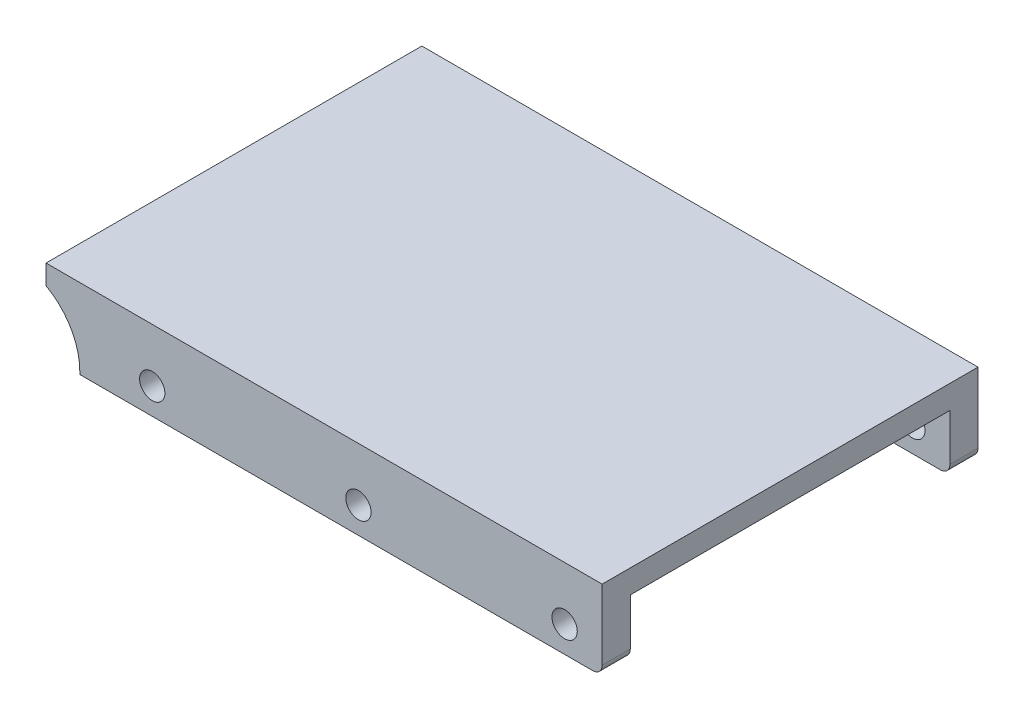
ISO-10303-21;
HEADER;
FILE_DESCRIPTION(('STEP AP214'),'2;1');
FILE_NAME('part.step','',(''),(''),'','','');
FILE_SCHEMA(('AUTOMOTIVE_DESIGN { 1 0 10303 214 1 1 1 1 }'));
ENDSEC;
DATA;
#1=APPLICATION_CONTEXT('core data for automotive mechanical design processes');
#2=APPLICATION_PROTOCOL_DEFINITION('international standard','automotive_design',2000,#1);
#3=PRODUCT_CONTEXT('',#1,'mechanical');
#4=PRODUCT('Part','Part','',(#3));
#5=PRODUCT_RELATED_PRODUCT_CATEGORY('part','',(#4));
#6=PRODUCT_DEFINITION_FORMATION('','',#4);
#7=PRODUCT_DEFINITION_CONTEXT('part definition',#1,'design');
#8=PRODUCT_DEFINITION('design','',#6,#7);
#9=PRODUCT_DEFINITION_SHAPE('','',#8);
#10=(LENGTH_UNIT() NAMED_UNIT(*) SI_UNIT(.MILLI.,.METRE.));
#11=(NAMED_UNIT(*) PLANE_ANGLE_UNIT() SI_UNIT($,.RADIAN.));
#12=(NAMED_UNIT(*) SI_UNIT($,.STERADIAN.) SOLID_ANGLE_UNIT());
#13=UNCERTAINTY_MEASURE_WITH_UNIT(LENGTH_MEASURE(1.E-05),#10,'distance_accuracy_value','');
#14=(GEOMETRIC_REPRESENTATION_CONTEXT(3) GLOBAL_UNCERTAINTY_ASSIGNED_CONTEXT((#13)) GLOBAL_UNIT_ASSIGNED_CONTEXT((#10,
#11,#12)) REPRESENTATION_CONTEXT('',''));
#15=CARTESIAN_POINT('',(0.,0.,0.));
#16=DIRECTION('',(0.,0.,1.));
#17=DIRECTION('',(1.,0.,0.));
#18=AXIS2_PLACEMENT_3D('',#15,#16,#17);
#19=CARTESIAN_POINT('',(76.0000000000001,-2.77555756156289E-13,40.1));
#20=DIRECTION('',(0.,1.,0.));
#21=DIRECTION('',(-1.,0.,0.));
#22=AXIS2_PLACEMENT_3D('',#19,#20,#21);
#23=PLANE('',#22);
#24=DIRECTION('',(1.,0.,0.));
#25=VECTOR('',#24,1.);
#26=CARTESIAN_POINT('',(19.,-3.33066907387547E-13,3.00000000000007));
#27=LINE('',#26,#25);
#28=CARTESIAN_POINT('',(20.2702830408414,0.,3.00000000000001));
#29=VERTEX_POINT('',#28);
#30=CARTESIAN_POINT('',(75.0000000000008,-1.80411241501588E-13,2.99999999999998));
#31=VERTEX_POINT('',#30);
#32=EDGE_CURVE('E239',#29,#31,#27,.T.);
#33=ORIENTED_EDGE('',*,*,#32,.F.);
#34=DIRECTION('',(0.,0.,1.00000000000001));
#35=VECTOR('',#34,1.);
#36=CARTESIAN_POINT('',(20.2702830408414,-4.9960036108132E-13,0.));
#37=LINE('',#36,#35);
#38=CARTESIAN_POINT('',(20.2702830408414,-4.9960036108132E-13,0.));
#39=VERTEX_POINT('',#38);
#40=EDGE_CURVE('E240',#39,#29,#37,.T.);
#41=ORIENTED_EDGE('',*,*,#40,.F.);
#42=DIRECTION('',(1.,0.,0.));
#43=VECTOR('',#42,1.);
#44=CARTESIAN_POINT('',(76.0000000000003,0.,0.));
#45=LINE('',#44,#43);
#46=CARTESIAN_POINT('',(75.0000000000005,0.,0.));
#47=VERTEX_POINT('',#46);
#48=EDGE_CURVE('E201',#39,#47,#45,.T.);
#49=ORIENTED_EDGE('',*,*,#48,.T.);
#50=DIRECTION('',(0.,0.,-1.00000000000001));
#51=VECTOR('',#50,1.);
#52=CARTESIAN_POINT('',(75.0000000000005,-5.68989300120393E-13,40.1000000000002));
#53=LINE('',#52,#51);
#54=EDGE_CURVE('E168',#47,#31,#53,.F.);
#55=ORIENTED_EDGE('',*,*,#54,.T.);
#56=EDGE_LOOP('',(#33,#41,#49,#55));
#57=FACE_BOUND('',#56,.T.);
#58=ADVANCED_FACE('F34',(#57),#23,.F.);
#59=CARTESIAN_POINT('',(20.2702830408415,7.27395464180314,0.));
#60=DIRECTION('',(1.,0.,0.));
#61=DIRECTION('',(0.,0.,-1.00000000000001));
#62=AXIS2_PLACEMENT_3D('',#59,#60,#61);
#63=PLANE('',#62);
#64=ORIENTED_EDGE('',*,*,#40,.T.);
#65=DIRECTION('',(0.,1.,0.));
#66=VECTOR('',#65,1.);
#67=CARTESIAN_POINT('',(20.2702830408414,7.27395464180332,3.00000000000004));
#68=LINE('',#67,#66);
#69=CARTESIAN_POINT('',(20.2702830408414,0.273954641803464,2.99999999999995));
#70=VERTEX_POINT('',#69);
#71=EDGE_CURVE('E257',#29,#70,#68,.T.);
#72=ORIENTED_EDGE('',*,*,#71,.T.);
#73=DIRECTION('',(0.,0.,1.00000000000001));
#74=VECTOR('',#73,1.);
#75=CARTESIAN_POINT('',(20.2702830408414,0.273954641803187,0.));
#76=LINE('',#75,#74);
#77=CARTESIAN_POINT('',(20.2702830408414,0.273954641803187,0.));
#78=VERTEX_POINT('',#77);
#79=EDGE_CURVE('E157',#70,#78,#76,.F.);
#80=ORIENTED_EDGE('',*,*,#79,.T.);
#81=DIRECTION('',(0.,1.,0.));
#82=VECTOR('',#81,1.);
#83=CARTESIAN_POINT('',(20.2702830408415,7.27395464180314,0.));
#84=LINE('',#83,#82);
#85=EDGE_CURVE('E249',#39,#78,#84,.T.);
#86=ORIENTED_EDGE('',*,*,#85,.F.);
#87=EDGE_LOOP('',(#64,#72,#80,#86));
#88=FACE_BOUND('',#87,.T.);
#89=ADVANCED_FACE('F285',(#88),#63,.F.);
#90=CARTESIAN_POINT('',(5.99999999999971,8.49999999999998,40.1));
#91=DIRECTION('',(0.,-1.,0.));
#92=DIRECTION('',(0.,0.,-1.00000000000001));
#93=AXIS2_PLACEMENT_3D('',#90,#91,#92);
#94=PLANE('',#93);
#95=DIRECTION('',(-1.,0.,0.));
#96=VECTOR('',#95,1.);
#97=CARTESIAN_POINT('',(5.99999999999984,8.49999999999942,0.));
#98=LINE('',#97,#96);
#99=CARTESIAN_POINT('',(76.,8.50000000000001,0.));
#100=VERTEX_POINT('',#99);
#101=CARTESIAN_POINT('',(16.6623999999998,8.49999999999944,0.));
#102=VERTEX_POINT('',#101);
#103=EDGE_CURVE('E205',#100,#102,#98,.T.);
#104=ORIENTED_EDGE('',*,*,#103,.T.);
#105=DIRECTION('',(0.,0.,1.00000000000001));
#106=VECTOR('',#105,1.);
#107=CARTESIAN_POINT('',(16.6623999999998,8.49999999999944,0.));
#108=LINE('',#107,#106);
#109=CARTESIAN_POINT('',(16.6623999999999,8.49999999999944,40.1));
#110=VERTEX_POINT('',#109);
#111=EDGE_CURVE('E250',#102,#110,#108,.T.);
#112=ORIENTED_EDGE('',*,*,#111,.T.);
#113=DIRECTION('',(-1.,0.,0.));
#114=VECTOR('',#113,1.);
#115=CARTESIAN_POINT('',(5.99999999999971,8.49999999999998,40.1));
#116=LINE('',#115,#114);
#117=CARTESIAN_POINT('',(76.,8.49999999999972,40.1));
#118=VERTEX_POINT('',#117);
#119=EDGE_CURVE('E204',#118,#110,#116,.T.);
#120=ORIENTED_EDGE('',*,*,#119,.F.);
#121=DIRECTION('',(0.,0.,-1.00000000000001));
#122=VECTOR('',#121,1.);
#123=CARTESIAN_POINT('',(76.,8.49999999999972,40.1));
#124=LINE('',#123,#122);
#125=EDGE_CURVE('E180',#118,#100,#124,.T.);
#126=ORIENTED_EDGE('',*,*,#125,.T.);
#127=EDGE_LOOP('',(#104,#112,#120,#126));
#128=FACE_BOUND('',#127,.T.);
#129=ADVANCED_FACE('F313',(#128),#94,.F.);
#130=CARTESIAN_POINT('',(27.996,2.8,-10.7000000000001));
#131=DIRECTION('',(0.,0.,1.00000000000001));
#132=DIRECTION('',(1.,0.,0.));
#133=AXIS2_PLACEMENT_3D('',#130,#131,#132);
#134=CYLINDRICAL_SURFACE('',#133,1.35);
#135=CARTESIAN_POINT('',(27.996,2.79999999999997,37.1));
#136=DIRECTION('',(0.,0.,1.00000000000001));
#137=DIRECTION('',(1.,0.,0.));
#138=AXIS2_PLACEMENT_3D('',#135,#136,#137);
#139=CIRCLE('',#138,1.35);
#140=CARTESIAN_POINT('',(29.346,2.79999999999997,37.1));
#141=VERTEX_POINT('',#140);
#142=EDGE_CURVE('E225',#141,#141,#139,.F.);
#143=ORIENTED_EDGE('',*,*,#142,.T.);
#144=EDGE_LOOP('',(#143));
#145=FACE_BOUND('',#144,.T.);
#146=CARTESIAN_POINT('',(27.996,2.79999999999983,40.1));
#147=DIRECTION('',(0.,0.,1.00000000000001));
#148=DIRECTION('',(1.,0.,0.));
#149=AXIS2_PLACEMENT_3D('',#146,#147,#148);
#150=CIRCLE('',#149,1.35);
#151=CARTESIAN_POINT('',(29.3460000000001,2.79999999999983,40.1));
#152=VERTEX_POINT('',#151);
#153=EDGE_CURVE('E197',#152,#152,#150,.T.);
#154=ORIENTED_EDGE('',*,*,#153,.T.);
#155=EDGE_LOOP('',(#154));
#156=FACE_BOUND('',#155,.T.);
#157=ADVANCED_FACE('F328',(#145,#156),#134,.F.);
#158=CARTESIAN_POINT('',(49.9960000000001,2.79999999999971,-10.7000000000001));
#159=DIRECTION('',(0.,0.,1.00000000000001));
#160=DIRECTION('',(1.,0.,0.));
#161=AXIS2_PLACEMENT_3D('',#158,#159,#160);
#162=CYLINDRICAL_SURFACE('',#161,1.35);
#163=CARTESIAN_POINT('',(49.996,2.79999999999997,37.1000000000001));
#164=DIRECTION('',(0.,0.,1.00000000000001));
#165=DIRECTION('',(1.,0.,0.));
#166=AXIS2_PLACEMENT_3D('',#163,#164,#165);
#167=CIRCLE('',#166,1.35);
#168=CARTESIAN_POINT('',(51.346,2.79999999999997,37.1000000000001));
#169=VERTEX_POINT('',#168);
#170=EDGE_CURVE('E184',#169,#169,#167,.F.);
#171=ORIENTED_EDGE('',*,*,#170,.T.);
#172=EDGE_LOOP('',(#171));
#173=FACE_BOUND('',#172,.T.);
#174=CARTESIAN_POINT('',(49.9960000000002,2.8,40.1));
#175=DIRECTION('',(0.,0.,1.00000000000001));
#176=DIRECTION('',(1.,0.,0.));
#177=AXIS2_PLACEMENT_3D('',#174,#175,#176);
#178=CIRCLE('',#177,1.35);
#179=CARTESIAN_POINT('',(51.3460000000002,2.8,40.1));
#180=VERTEX_POINT('',#179);
#181=EDGE_CURVE('E192',#180,#180,#178,.T.);
#182=ORIENTED_EDGE('',*,*,#181,.T.);
#183=EDGE_LOOP('',(#182));
#184=FACE_BOUND('',#183,.T.);
#185=ADVANCED_FACE('F321',(#173,#184),#162,.F.);
#186=CARTESIAN_POINT('',(71.9960000000003,2.79999999999932,-10.7));
#187=DIRECTION('',(0.,0.,1.00000000000001));
#188=DIRECTION('',(1.,0.,0.));
#189=AXIS2_PLACEMENT_3D('',#186,#187,#188);
#190=CYLINDRICAL_SURFACE('',#189,1.35000000000001);
#191=CARTESIAN_POINT('',(71.9960000000004,2.80000000000018,37.1000000000002));
#192=DIRECTION('',(0.,0.,1.00000000000001));
#193=DIRECTION('',(1.,0.,0.));
#194=AXIS2_PLACEMENT_3D('',#191,#192,#193);
#195=CIRCLE('',#194,1.35000000000001);
#196=CARTESIAN_POINT('',(73.3460000000005,2.80000000000018,37.1000000000002));
#197=VERTEX_POINT('',#196);
#198=EDGE_CURVE('E181',#197,#197,#195,.F.);
#199=ORIENTED_EDGE('',*,*,#198,.T.);
#200=EDGE_LOOP('',(#199));
#201=FACE_BOUND('',#200,.T.);
#202=CARTESIAN_POINT('',(71.9960000000003,2.79999999999997,40.0999999999999));
#203=DIRECTION('',(0.,0.,1.00000000000001));
#204=DIRECTION('',(1.,0.,0.));
#205=AXIS2_PLACEMENT_3D('',#202,#203,#204);
#206=CIRCLE('',#205,1.35000000000001);
#207=CARTESIAN_POINT('',(73.3460000000003,2.79999999999997,40.0999999999999));
#208=VERTEX_POINT('',#207);
#209=EDGE_CURVE('E193',#208,#208,#206,.T.);
#210=ORIENTED_EDGE('',*,*,#209,.T.);
#211=EDGE_LOOP('',(#210));
#212=FACE_BOUND('',#211,.T.);
#213=ADVANCED_FACE('F316',(#201,#212),#190,.F.);
#214=CARTESIAN_POINT('',(20.2702830408413,0.,37.1000000000001));
#215=VERTEX_POINT('',#214);
#216=CARTESIAN_POINT('',(20.2702830408415,-3.88578058618805E-13,40.1000000000001));
#217=VERTEX_POINT('',#216);
#218=EDGE_CURVE('E245',#215,#217,#37,.T.);
#219=ORIENTED_EDGE('',*,*,#218,.F.);
#220=DIRECTION('',(-1.,0.,0.));
#221=VECTOR('',#220,1.);
#222=CARTESIAN_POINT('',(19.,-4.30211422042248E-13,37.1000000000004));
#223=LINE('',#222,#221);
#224=CARTESIAN_POINT('',(75.0000000000006,0.,37.1));
#225=VERTEX_POINT('',#224);
#226=EDGE_CURVE('E237',#225,#215,#223,.T.);
#227=ORIENTED_EDGE('',*,*,#226,.F.);
#228=DIRECTION('',(0.,0.,-1.00000000000001));
#229=VECTOR('',#228,1.);
#230=CARTESIAN_POINT('',(75.0000000000005,-5.68989300120393E-13,40.1000000000002));
#231=LINE('',#230,#229);
#232=CARTESIAN_POINT('',(75.0000000000005,-5.68989300120393E-13,40.1000000000002));
#233=VERTEX_POINT('',#232);
#234=EDGE_CURVE('E171',#225,#233,#231,.F.);
#235=ORIENTED_EDGE('',*,*,#234,.T.);
#236=DIRECTION('',(1.,0.,0.));
#237=VECTOR('',#236,1.);
#238=CARTESIAN_POINT('',(76.0000000000001,-2.77555756156289E-13,40.1));
#239=LINE('',#238,#237);
#240=EDGE_CURVE('E208',#217,#233,#239,.T.);
#241=ORIENTED_EDGE('',*,*,#240,.F.);
#242=EDGE_LOOP('',(#219,#227,#235,#241));
#243=FACE_BOUND('',#242,.T.);
#244=ADVANCED_FACE('F268',(#243),#23,.F.);
#245=CARTESIAN_POINT('',(76.,8.49999999999972,40.1));
#246=DIRECTION('',(-1.,0.,0.));
#247=DIRECTION('',(0.,0.,1.00000000000001));
#248=AXIS2_PLACEMENT_3D('',#245,#246,#247);
#249=PLANE('',#248);
#250=DIRECTION('',(0.,-1.,0.));
#251=VECTOR('',#250,1.);
#252=CARTESIAN_POINT('',(76.0000000000003,8.49999999999999,3.00000000000002));
#253=LINE('',#252,#251);
#254=CARTESIAN_POINT('',(76.0000000000003,5.99999999999999,3.00000000000002));
#255=VERTEX_POINT('',#254);
#256=CARTESIAN_POINT('',(76.0000000000003,0.99999999999982,3.00000000000003));
#257=VERTEX_POINT('',#256);
#258=EDGE_CURVE('E185',#255,#257,#253,.T.);
#259=ORIENTED_EDGE('',*,*,#258,.T.);
#260=DIRECTION('',(0.,0.,-1.00000000000001));
#261=VECTOR('',#260,1.);
#262=CARTESIAN_POINT('',(76.0000000000002,0.999999999999779,40.1000000000002));
#263=LINE('',#262,#261);
#264=CARTESIAN_POINT('',(76.0000000000003,1.00000000000028,0.));
#265=VERTEX_POINT('',#264);
#266=EDGE_CURVE('E162',#257,#265,#263,.T.);
#267=ORIENTED_EDGE('',*,*,#266,.T.);
#268=DIRECTION('',(0.,1.,0.));
#269=VECTOR('',#268,1.);
#270=CARTESIAN_POINT('',(76.,8.50000000000001,0.));
#271=LINE('',#270,#269);
#272=EDGE_CURVE('E209',#265,#100,#271,.T.);
#273=ORIENTED_EDGE('',*,*,#272,.T.);
#274=ORIENTED_EDGE('',*,*,#125,.F.);
#275=DIRECTION('',(0.,1.,0.));
#276=VECTOR('',#275,1.);
#277=CARTESIAN_POINT('',(76.,8.49999999999972,40.1));
#278=LINE('',#277,#276);
#279=CARTESIAN_POINT('',(76.0000000000002,0.999999999999779,40.1000000000002));
#280=VERTEX_POINT('',#279);
#281=EDGE_CURVE('E214',#280,#118,#278,.T.);
#282=ORIENTED_EDGE('',*,*,#281,.F.);
#283=DIRECTION('',(0.,0.,-1.00000000000001));
#284=VECTOR('',#283,1.);
#285=CARTESIAN_POINT('',(76.0000000000002,0.999999999999779,40.1000000000002));
#286=LINE('',#285,#284);
#287=CARTESIAN_POINT('',(76.0000000000003,0.999999999999918,37.1));
#288=VERTEX_POINT('',#287);
#289=EDGE_CURVE('E165',#280,#288,#286,.T.);
#290=ORIENTED_EDGE('',*,*,#289,.T.);
#291=DIRECTION('',(0.,1.,0.));
#292=VECTOR('',#291,1.);
#293=CARTESIAN_POINT('',(76.0000000000003,8.49999999999999,37.1000000000001));
#294=LINE('',#293,#292);
#295=CARTESIAN_POINT('',(76.0000000000003,5.99999999999989,37.1000000000001));
#296=VERTEX_POINT('',#295);
#297=EDGE_CURVE('E223',#288,#296,#294,.T.);
#298=ORIENTED_EDGE('',*,*,#297,.T.);
#299=DIRECTION('',(0.,0.,1.00000000000001));
#300=VECTOR('',#299,1.);
#301=CARTESIAN_POINT('',(76.,5.99999999999995,40.1));
#302=LINE('',#301,#300);
#303=EDGE_CURVE('E135',#255,#296,#302,.T.);
#304=ORIENTED_EDGE('',*,*,#303,.F.);
#305=EDGE_LOOP('',(#259,#267,#273,#274,#282,#290,#298,#304));
#306=FACE_BOUND('',#305,.T.);
#307=ADVANCED_FACE('F295',(#306),#249,.F.);
#308=CARTESIAN_POINT('',(-3.05311331771918E-13,0.,40.0999999999999));
#309=DIRECTION('',(0.,0.,-1.00000000000001));
#310=DIRECTION('',(-1.,0.,0.));
#311=AXIS2_PLACEMENT_3D('',#308,#309,#310);
#312=PLANE('',#311);
#313=ORIENTED_EDGE('',*,*,#119,.T.);
#314=DIRECTION('',(0.,1.,0.));
#315=VECTOR('',#314,1.);
#316=CARTESIAN_POINT('',(16.6623999999999,8.49999999999944,40.1));
#317=LINE('',#316,#315);
#318=CARTESIAN_POINT('',(16.6623999999999,6.39715172628352,40.1));
#319=VERTEX_POINT('',#318);
#320=EDGE_CURVE('E255',#319,#110,#317,.T.);
#321=ORIENTED_EDGE('',*,*,#320,.F.);
#322=CARTESIAN_POINT('',(13.2702830408414,0.273954641803451,40.1));
#323=DIRECTION('',(0.,0.,-1.00000000000001));
#324=DIRECTION('',(-1.,0.,0.));
#325=AXIS2_PLACEMENT_3D('',#322,#323,#324);
#326=CIRCLE('',#325,7.);
#327=CARTESIAN_POINT('',(20.2702830408416,0.273954641802979,40.1000000000001));
#328=VERTEX_POINT('',#327);
#329=EDGE_CURVE('E153',#319,#328,#326,.T.);
#330=ORIENTED_EDGE('',*,*,#329,.T.);
#331=DIRECTION('',(0.,1.,0.));
#332=VECTOR('',#331,1.);
#333=CARTESIAN_POINT('',(20.2702830408413,7.27395464180318,40.1));
#334=LINE('',#333,#332);
#335=EDGE_CURVE('E246',#217,#328,#334,.T.);
#336=ORIENTED_EDGE('',*,*,#335,.F.);
#337=ORIENTED_EDGE('',*,*,#240,.T.);
#338=CARTESIAN_POINT('',(75.0000000000003,0.999999999999973,40.1000000000002));
#339=DIRECTION('',(0.,0.,-1.00000000000001));
#340=DIRECTION('',(-1.,0.,0.));
#341=AXIS2_PLACEMENT_3D('',#338,#339,#340);
#342=CIRCLE('',#341,1.);
#343=EDGE_CURVE('E177',#233,#280,#342,.F.);
#344=ORIENTED_EDGE('',*,*,#343,.T.);
#345=ORIENTED_EDGE('',*,*,#281,.T.);
#346=EDGE_LOOP('',(#313,#321,#330,#336,#337,#344,#345));
#347=FACE_BOUND('',#346,.T.);
#348=ORIENTED_EDGE('',*,*,#209,.F.);
#349=EDGE_LOOP('',(#348));
#350=FACE_BOUND('',#349,.T.);
#351=ORIENTED_EDGE('',*,*,#181,.F.);
#352=EDGE_LOOP('',(#351));
#353=FACE_BOUND('',#352,.T.);
#354=ORIENTED_EDGE('',*,*,#153,.F.);
#355=EDGE_LOOP('',(#354));
#356=FACE_BOUND('',#355,.T.);
#357=ADVANCED_FACE('F272',(#347,#350,#353,#356),#312,.F.);
#358=CARTESIAN_POINT('',(0.,0.,0.));
#359=DIRECTION('',(0.,0.,-1.00000000000001));
#360=DIRECTION('',(-1.,0.,0.));
#361=AXIS2_PLACEMENT_3D('',#358,#359,#360);
#362=PLANE('',#361);
#363=DIRECTION('',(0.,1.,0.));
#364=VECTOR('',#363,1.);
#365=CARTESIAN_POINT('',(16.6623999999998,8.49999999999944,0.));
#366=LINE('',#365,#364);
#367=CARTESIAN_POINT('',(16.6624,6.39715172628345,0.));
#368=VERTEX_POINT('',#367);
#369=EDGE_CURVE('E57',#368,#102,#366,.T.);
#370=ORIENTED_EDGE('',*,*,#369,.T.);
#371=ORIENTED_EDGE('',*,*,#103,.F.);
#372=ORIENTED_EDGE('',*,*,#272,.F.);
#373=CARTESIAN_POINT('',(75.0000000000003,0.999999999999709,0.));
#374=DIRECTION('',(0.,0.,-1.00000000000001));
#375=DIRECTION('',(-1.,0.,0.));
#376=AXIS2_PLACEMENT_3D('',#373,#374,#375);
#377=CIRCLE('',#376,1.);
#378=EDGE_CURVE('E174',#265,#47,#377,.T.);
#379=ORIENTED_EDGE('',*,*,#378,.T.);
#380=ORIENTED_EDGE('',*,*,#48,.F.);
#381=ORIENTED_EDGE('',*,*,#85,.T.);
#382=CARTESIAN_POINT('',(13.2702830408414,0.273954641803159,0.));
#383=DIRECTION('',(0.,0.,-1.00000000000001));
#384=DIRECTION('',(-1.,0.,0.));
#385=AXIS2_PLACEMENT_3D('',#382,#383,#384);
#386=CIRCLE('',#385,7.);
#387=EDGE_CURVE('E150',#78,#368,#386,.F.);
#388=ORIENTED_EDGE('',*,*,#387,.T.);
#389=EDGE_LOOP('',(#370,#371,#372,#379,#380,#381,#388));
#390=FACE_BOUND('',#389,.T.);
#391=CARTESIAN_POINT('',(71.9960000000003,2.79999999999971,0.));
#392=DIRECTION('',(0.,0.,-1.00000000000001));
#393=DIRECTION('',(-1.,0.,0.));
#394=AXIS2_PLACEMENT_3D('',#391,#392,#393);
#395=CIRCLE('',#394,1.35000000000001);
#396=CARTESIAN_POINT('',(70.6460000000003,2.7999999999997,0.));
#397=VERTEX_POINT('',#396);
#398=EDGE_CURVE('E189',#397,#397,#395,.T.);
#399=ORIENTED_EDGE('',*,*,#398,.F.);
#400=EDGE_LOOP('',(#399));
#401=FACE_BOUND('',#400,.T.);
#402=CARTESIAN_POINT('',(49.9960000000001,2.7999999999998,0.));
#403=DIRECTION('',(0.,0.,-1.00000000000001));
#404=DIRECTION('',(-1.,0.,0.));
#405=AXIS2_PLACEMENT_3D('',#402,#403,#404);
#406=CIRCLE('',#405,1.35);
#407=CARTESIAN_POINT('',(48.6460000000001,2.7999999999998,0.));
#408=VERTEX_POINT('',#407);
#409=EDGE_CURVE('E194',#408,#408,#406,.T.);
#410=ORIENTED_EDGE('',*,*,#409,.F.);
#411=EDGE_LOOP('',(#410));
#412=FACE_BOUND('',#411,.T.);
#413=CARTESIAN_POINT('',(27.9959999999999,2.79999999999996,0.));
#414=DIRECTION('',(0.,0.,-1.00000000000001));
#415=DIRECTION('',(-1.,0.,0.));
#416=AXIS2_PLACEMENT_3D('',#413,#414,#415);
#417=CIRCLE('',#416,1.35);
#418=CARTESIAN_POINT('',(26.6459999999999,2.79999999999995,0.));
#419=VERTEX_POINT('',#418);
#420=EDGE_CURVE('E198',#419,#419,#417,.T.);
#421=ORIENTED_EDGE('',*,*,#420,.F.);
#422=EDGE_LOOP('',(#421));
#423=FACE_BOUND('',#422,.T.);
#424=ADVANCED_FACE('F279',(#390,#401,#412,#423),#362,.T.);
#425=CARTESIAN_POINT('',(27.996,2.80000000000008,3.00000000000004));
#426=DIRECTION('',(0.,0.,-1.00000000000001));
#427=DIRECTION('',(-1.,0.,0.));
#428=AXIS2_PLACEMENT_3D('',#425,#426,#427);
#429=CIRCLE('',#428,1.35);
#430=CARTESIAN_POINT('',(26.646,2.80000000000008,3.00000000000004));
#431=VERTEX_POINT('',#430);
#432=EDGE_CURVE('E232',#431,#431,#429,.F.);
#433=ORIENTED_EDGE('',*,*,#432,.T.);
#434=EDGE_LOOP('',(#433));
#435=FACE_BOUND('',#434,.T.);
#436=ORIENTED_EDGE('',*,*,#420,.T.);
#437=EDGE_LOOP('',(#436));
#438=FACE_BOUND('',#437,.T.);
#439=ADVANCED_FACE('F341',(#435,#438),#134,.F.);
#440=CARTESIAN_POINT('',(49.9959999999999,2.79999999999978,2.99999999999987));
#441=DIRECTION('',(0.,0.,-1.00000000000001));
#442=DIRECTION('',(-1.,0.,0.));
#443=AXIS2_PLACEMENT_3D('',#440,#441,#442);
#444=CIRCLE('',#443,1.35);
#445=CARTESIAN_POINT('',(48.6459999999999,2.79999999999977,2.99999999999987));
#446=VERTEX_POINT('',#445);
#447=EDGE_CURVE('E188',#446,#446,#444,.F.);
#448=ORIENTED_EDGE('',*,*,#447,.T.);
#449=EDGE_LOOP('',(#448));
#450=FACE_BOUND('',#449,.T.);
#451=ORIENTED_EDGE('',*,*,#409,.T.);
#452=EDGE_LOOP('',(#451));
#453=FACE_BOUND('',#452,.T.);
#454=ADVANCED_FACE('F331',(#450,#453),#162,.F.);
#455=CARTESIAN_POINT('',(71.9960000000002,2.79999999999955,2.99999999999981));
#456=DIRECTION('',(0.,0.,-1.00000000000001));
#457=DIRECTION('',(-1.,0.,0.));
#458=AXIS2_PLACEMENT_3D('',#455,#456,#457);
#459=CIRCLE('',#458,1.35000000000001);
#460=CARTESIAN_POINT('',(70.6460000000002,2.79999999999955,2.99999999999981));
#461=VERTEX_POINT('',#460);
#462=EDGE_CURVE('E137',#461,#461,#459,.F.);
#463=ORIENTED_EDGE('',*,*,#462,.T.);
#464=EDGE_LOOP('',(#463));
#465=FACE_BOUND('',#464,.T.);
#466=ORIENTED_EDGE('',*,*,#398,.T.);
#467=EDGE_LOOP('',(#466));
#468=FACE_BOUND('',#467,.T.);
#469=ADVANCED_FACE('F324',(#465,#468),#190,.F.);
#470=CARTESIAN_POINT('',(-5.13478148889135E-13,5.99999999999971,0.));
#471=DIRECTION('',(0.,-1.,0.));
#472=DIRECTION('',(1.,0.,0.));
#473=AXIS2_PLACEMENT_3D('',#470,#471,#472);
#474=PLANE('',#473);
#475=DIRECTION('',(-1.,0.,0.));
#476=VECTOR('',#475,1.);
#477=CARTESIAN_POINT('',(19.,5.99999999999971,37.1000000000001));
#478=LINE('',#477,#476);
#479=CARTESIAN_POINT('',(17.2967460738117,5.99999999999946,37.1000000000003));
#480=VERTEX_POINT('',#479);
#481=EDGE_CURVE('E131',#296,#480,#478,.T.);
#482=ORIENTED_EDGE('',*,*,#481,.T.);
#483=DIRECTION('',(0.,0.,-1.00000000000001));
#484=VECTOR('',#483,1.);
#485=CARTESIAN_POINT('',(17.2967460738117,5.99999999999938,0.));
#486=LINE('',#485,#484);
#487=CARTESIAN_POINT('',(17.2967460738117,5.99999999999939,3.00000000000005));
#488=VERTEX_POINT('',#487);
#489=EDGE_CURVE('E42',#488,#480,#486,.F.);
#490=ORIENTED_EDGE('',*,*,#489,.F.);
#491=DIRECTION('',(1.,0.,0.));
#492=VECTOR('',#491,1.);
#493=CARTESIAN_POINT('',(19.,5.99999999999941,3.00000000000001));
#494=LINE('',#493,#492);
#495=EDGE_CURVE('E138',#488,#255,#494,.T.);
#496=ORIENTED_EDGE('',*,*,#495,.T.);
#497=ORIENTED_EDGE('',*,*,#303,.T.);
#498=EDGE_LOOP('',(#482,#490,#496,#497));
#499=FACE_BOUND('',#498,.T.);
#500=ADVANCED_FACE('F132',(#499),#474,.T.);
#501=CARTESIAN_POINT('',(19.,5.99999999999971,37.1000000000001));
#502=DIRECTION('',(0.,0.,1.00000000000001));
#503=DIRECTION('',(1.,0.,0.));
#504=AXIS2_PLACEMENT_3D('',#501,#502,#503);
#505=PLANE('',#504);
#506=ORIENTED_EDGE('',*,*,#142,.F.);
#507=EDGE_LOOP('',(#506));
#508=FACE_BOUND('',#507,.T.);
#509=ORIENTED_EDGE('',*,*,#198,.F.);
#510=EDGE_LOOP('',(#509));
#511=FACE_BOUND('',#510,.T.);
#512=ORIENTED_EDGE('',*,*,#170,.F.);
#513=EDGE_LOOP('',(#512));
#514=FACE_BOUND('',#513,.T.);
#515=ORIENTED_EDGE('',*,*,#226,.T.);
#516=DIRECTION('',(0.,-1.,0.));
#517=VECTOR('',#516,1.);
#518=CARTESIAN_POINT('',(20.2702830408412,7.27395464180344,37.1));
#519=LINE('',#518,#517);
#520=CARTESIAN_POINT('',(20.2702830408412,0.273954641803173,37.1000000000002));
#521=VERTEX_POINT('',#520);
#522=EDGE_CURVE('E49',#521,#215,#519,.T.);
#523=ORIENTED_EDGE('',*,*,#522,.F.);
#524=CARTESIAN_POINT('',(13.2702830408414,0.27395464180309,37.1000000000003));
#525=DIRECTION('',(0.,0.,1.00000000000001));
#526=DIRECTION('',(1.,0.,0.));
#527=AXIS2_PLACEMENT_3D('',#524,#525,#526);
#528=CIRCLE('',#527,7.);
#529=EDGE_CURVE('E140',#480,#521,#528,.F.);
#530=ORIENTED_EDGE('',*,*,#529,.F.);
#531=ORIENTED_EDGE('',*,*,#481,.F.);
#532=ORIENTED_EDGE('',*,*,#297,.F.);
#533=CARTESIAN_POINT('',(75.0000000000006,0.99999999999989,37.1000000000002));
#534=DIRECTION('',(0.,0.,1.00000000000001));
#535=DIRECTION('',(1.,0.,0.));
#536=AXIS2_PLACEMENT_3D('',#533,#534,#535);
#537=CIRCLE('',#536,1.);
#538=EDGE_CURVE('E158',#288,#225,#537,.F.);
#539=ORIENTED_EDGE('',*,*,#538,.T.);
#540=EDGE_LOOP('',(#515,#523,#530,#531,#532,#539));
#541=FACE_BOUND('',#540,.T.);
#542=ADVANCED_FACE('F141',(#508,#511,#514,#541),#505,.F.);
#543=CARTESIAN_POINT('',(19.,5.99999999999941,3.00000000000001));
#544=DIRECTION('',(0.,0.,-1.00000000000001));
#545=DIRECTION('',(-1.,0.,0.));
#546=AXIS2_PLACEMENT_3D('',#543,#544,#545);
#547=PLANE('',#546);
#548=ORIENTED_EDGE('',*,*,#432,.F.);
#549=EDGE_LOOP('',(#548));
#550=FACE_BOUND('',#549,.T.);
#551=ORIENTED_EDGE('',*,*,#462,.F.);
#552=EDGE_LOOP('',(#551));
#553=FACE_BOUND('',#552,.T.);
#554=ORIENTED_EDGE('',*,*,#447,.F.);
#555=EDGE_LOOP('',(#554));
#556=FACE_BOUND('',#555,.T.);
#557=ORIENTED_EDGE('',*,*,#495,.F.);
#558=CARTESIAN_POINT('',(13.2702830408413,0.273954641802771,3.00000000000002));
#559=DIRECTION('',(0.,0.,-1.00000000000001));
#560=DIRECTION('',(-1.,0.,0.));
#561=AXIS2_PLACEMENT_3D('',#558,#559,#560);
#562=CIRCLE('',#561,7.);
#563=EDGE_CURVE('E11',#70,#488,#562,.F.);
#564=ORIENTED_EDGE('',*,*,#563,.F.);
#565=ORIENTED_EDGE('',*,*,#71,.F.);
#566=ORIENTED_EDGE('',*,*,#32,.T.);
#567=CARTESIAN_POINT('',(75.0000000000003,0.999999999999585,3.0000000000001));
#568=DIRECTION('',(0.,0.,-1.00000000000001));
#569=DIRECTION('',(-1.,0.,0.));
#570=AXIS2_PLACEMENT_3D('',#567,#568,#569);
#571=CIRCLE('',#570,1.);
#572=EDGE_CURVE('E160',#31,#257,#571,.F.);
#573=ORIENTED_EDGE('',*,*,#572,.T.);
#574=ORIENTED_EDGE('',*,*,#258,.F.);
#575=EDGE_LOOP('',(#557,#564,#565,#566,#573,#574));
#576=FACE_BOUND('',#575,.T.);
#577=ADVANCED_FACE('F291',(#550,#553,#556,#576),#547,.F.);
#578=CARTESIAN_POINT('',(75.0000000000003,0.999999999999973,40.1000000000002));
#579=DIRECTION('',(0.,0.,-1.00000000000001));
#580=DIRECTION('',(-1.,0.,0.));
#581=AXIS2_PLACEMENT_3D('',#578,#579,#580);
#582=CYLINDRICAL_SURFACE('',#581,1.);
#583=ORIENTED_EDGE('',*,*,#572,.F.);
#584=ORIENTED_EDGE('',*,*,#54,.F.);
#585=ORIENTED_EDGE('',*,*,#378,.F.);
#586=ORIENTED_EDGE('',*,*,#266,.F.);
#587=EDGE_LOOP('',(#583,#584,#585,#586));
#588=FACE_BOUND('',#587,.T.);
#589=ADVANCED_FACE('F300',(#588),#582,.T.);
#590=CARTESIAN_POINT('',(75.0000000000003,0.999999999999973,40.1000000000002));
#591=DIRECTION('',(0.,0.,-1.00000000000001));
#592=DIRECTION('',(-1.,0.,0.));
#593=AXIS2_PLACEMENT_3D('',#590,#591,#592);
#594=CYLINDRICAL_SURFACE('',#593,1.);
#595=ORIENTED_EDGE('',*,*,#343,.F.);
#596=ORIENTED_EDGE('',*,*,#234,.F.);
#597=ORIENTED_EDGE('',*,*,#538,.F.);
#598=ORIENTED_EDGE('',*,*,#289,.F.);
#599=EDGE_LOOP('',(#595,#596,#597,#598));
#600=FACE_BOUND('',#599,.T.);
#601=ADVANCED_FACE('F298',(#600),#594,.T.);
#602=EDGE_CURVE('E155',#328,#521,#76,.F.);
#603=ORIENTED_EDGE('',*,*,#602,.T.);
#604=ORIENTED_EDGE('',*,*,#522,.T.);
#605=ORIENTED_EDGE('',*,*,#218,.T.);
#606=ORIENTED_EDGE('',*,*,#335,.T.);
#607=EDGE_LOOP('',(#603,#604,#605,#606));
#608=FACE_BOUND('',#607,.T.);
#609=ADVANCED_FACE('F263',(#608),#63,.F.);
#610=CARTESIAN_POINT('',(13.2702830408414,0.273954641803159,0.));
#611=DIRECTION('',(0.,0.,-1.00000000000001));
#612=DIRECTION('',(-1.,0.,0.));
#613=AXIS2_PLACEMENT_3D('',#610,#611,#612);
#614=CYLINDRICAL_SURFACE('',#613,7.);
#615=ORIENTED_EDGE('',*,*,#79,.F.);
#616=ORIENTED_EDGE('',*,*,#563,.T.);
#617=ORIENTED_EDGE('',*,*,#489,.T.);
#618=ORIENTED_EDGE('',*,*,#529,.T.);
#619=ORIENTED_EDGE('',*,*,#602,.F.);
#620=ORIENTED_EDGE('',*,*,#329,.F.);
#621=DIRECTION('',(0.,0.,-1.00000000000001));
#622=VECTOR('',#621,1.);
#623=CARTESIAN_POINT('',(16.6624,6.39715172628345,0.));
#624=LINE('',#623,#622);
#625=EDGE_CURVE('E145',#319,#368,#624,.T.);
#626=ORIENTED_EDGE('',*,*,#625,.T.);
#627=ORIENTED_EDGE('',*,*,#387,.F.);
#628=EDGE_LOOP('',(#615,#616,#617,#618,#619,#620,#626,#627));
#629=FACE_BOUND('',#628,.T.);
#630=ADVANCED_FACE('F36',(#629),#614,.F.);
#631=CARTESIAN_POINT('',(16.6623999999998,8.49999999999944,0.));
#632=DIRECTION('',(1.,0.,0.));
#633=DIRECTION('',(0.,0.,-1.00000000000001));
#634=AXIS2_PLACEMENT_3D('',#631,#632,#633);
#635=PLANE('',#634);
#636=ORIENTED_EDGE('',*,*,#320,.T.);
#637=ORIENTED_EDGE('',*,*,#111,.F.);
#638=ORIENTED_EDGE('',*,*,#369,.F.);
#639=ORIENTED_EDGE('',*,*,#625,.F.);
#640=EDGE_LOOP('',(#636,#637,#638,#639));
#641=FACE_BOUND('',#640,.T.);
#642=ADVANCED_FACE('F450',(#641),#635,.F.);
#643=CLOSED_SHELL('',(#58,#89,#129,#157,#185,#213,#244,#307,#357,#424,#439,#454,#469,#500,#542,
#577,#589,#601,#609,#630,#642));
#644=MANIFOLD_SOLID_BREP('B2',#643);
#645=ADVANCED_BREP_SHAPE_REPRESENTATION('',(#18,#644),#14);
#646=SHAPE_DEFINITION_REPRESENTATION(#9,#645);
ENDSEC;
END-ISO-10303-21;
